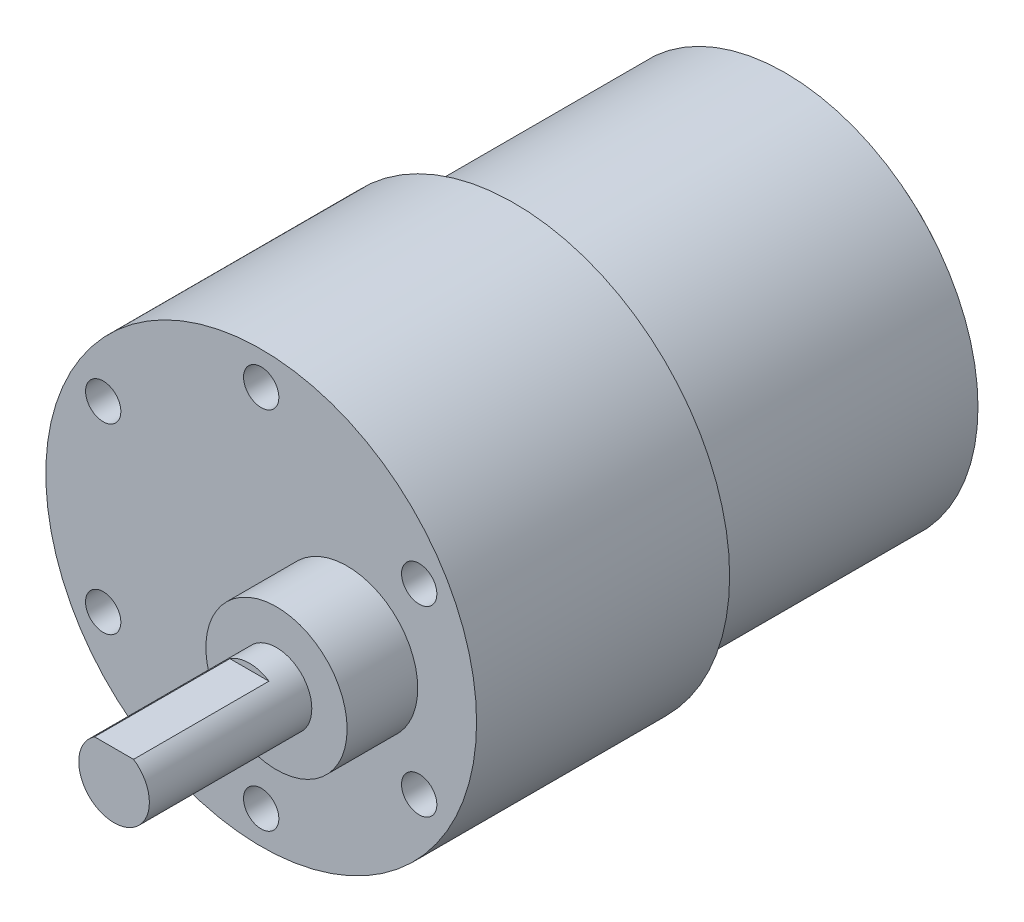
ISO-10303-21;
HEADER;
FILE_DESCRIPTION(('STEP AP214'),'2;1');
FILE_NAME('part.step','',(''),(''),'','','');
FILE_SCHEMA(('AUTOMOTIVE_DESIGN { 1 0 10303 214 1 1 1 1 }'));
ENDSEC;
DATA;
#1=APPLICATION_CONTEXT('core data for automotive mechanical design processes');
#2=APPLICATION_PROTOCOL_DEFINITION('international standard','automotive_design',2000,#1);
#3=PRODUCT_CONTEXT('',#1,'mechanical');
#4=PRODUCT('Part','Part','',(#3));
#5=PRODUCT_RELATED_PRODUCT_CATEGORY('part','',(#4));
#6=PRODUCT_DEFINITION_FORMATION('','',#4);
#7=PRODUCT_DEFINITION_CONTEXT('part definition',#1,'design');
#8=PRODUCT_DEFINITION('design','',#6,#7);
#9=PRODUCT_DEFINITION_SHAPE('','',#8);
#10=(LENGTH_UNIT() NAMED_UNIT(*) SI_UNIT(.MILLI.,.METRE.));
#11=(NAMED_UNIT(*) PLANE_ANGLE_UNIT() SI_UNIT($,.RADIAN.));
#12=(NAMED_UNIT(*) SI_UNIT($,.STERADIAN.) SOLID_ANGLE_UNIT());
#13=UNCERTAINTY_MEASURE_WITH_UNIT(LENGTH_MEASURE(1.E-05),#10,'distance_accuracy_value','');
#14=(GEOMETRIC_REPRESENTATION_CONTEXT(3) GLOBAL_UNCERTAINTY_ASSIGNED_CONTEXT((#13)) GLOBAL_UNIT_ASSIGNED_CONTEXT((#10,
#11,#12)) REPRESENTATION_CONTEXT('',''));
#15=CARTESIAN_POINT('',(0.,0.,0.));
#16=DIRECTION('',(0.,0.,1.));
#17=DIRECTION('',(1.,0.,0.));
#18=AXIS2_PLACEMENT_3D('',#15,#16,#17);
#19=CARTESIAN_POINT('',(0.,0.,-24.));
#20=DIRECTION('',(0.,0.,-1.));
#21=DIRECTION('',(-1.,0.,0.));
#22=AXIS2_PLACEMENT_3D('',#19,#20,#21);
#23=PLANE('',#22);
#24=CARTESIAN_POINT('',(0.,0.,-24.));
#25=DIRECTION('',(0.,0.,-1.));
#26=DIRECTION('',(-1.,0.,0.));
#27=AXIS2_PLACEMENT_3D('',#24,#25,#26);
#28=CIRCLE('',#27,3.);
#29=CARTESIAN_POINT('',(-3.,0.,-24.));
#30=VERTEX_POINT('',#29);
#31=EDGE_CURVE('E302',#30,#30,#28,.T.);
#32=ORIENTED_EDGE('',*,*,#31,.F.);
#33=EDGE_LOOP('',(#32));
#34=FACE_BOUND('',#33,.T.);
#35=DIRECTION('',(1.,0.,0.));
#36=VECTOR('',#35,1.);
#37=CARTESIAN_POINT('',(6.08083524904215,-9.54082068965496,-24.));
#38=LINE('',#37,#36);
#39=CARTESIAN_POINT('',(-6.08083524904215,-9.54082068965496,-24.));
#40=VERTEX_POINT('',#39);
#41=CARTESIAN_POINT('',(6.08083524904215,-9.54082068965496,-24.));
#42=VERTEX_POINT('',#41);
#43=EDGE_CURVE('E279',#40,#42,#38,.T.);
#44=ORIENTED_EDGE('',*,*,#43,.F.);
#45=DIRECTION('',(0.,-1.,0.));
#46=VECTOR('',#45,1.);
#47=CARTESIAN_POINT('',(-6.08083524904215,0.,-24.));
#48=LINE('',#47,#46);
#49=CARTESIAN_POINT('',(-6.08083524904215,-13.7121640405155,-24.));
#50=VERTEX_POINT('',#49);
#51=EDGE_CURVE('E387',#40,#50,#48,.T.);
#52=ORIENTED_EDGE('',*,*,#51,.T.);
#53=CARTESIAN_POINT('',(0.,0.,-24.));
#54=DIRECTION('',(0.,0.,-1.));
#55=DIRECTION('',(-1.,0.,0.));
#56=AXIS2_PLACEMENT_3D('',#53,#54,#55);
#57=CIRCLE('',#56,15.);
#58=CARTESIAN_POINT('',(6.08083524904215,-13.7121640405155,-24.));
#59=VERTEX_POINT('',#58);
#60=EDGE_CURVE('E301',#50,#59,#57,.T.);
#61=ORIENTED_EDGE('',*,*,#60,.T.);
#62=DIRECTION('',(0.,-1.,0.));
#63=VECTOR('',#62,1.);
#64=CARTESIAN_POINT('',(6.08083524904215,-14.0412651340994,-24.));
#65=LINE('',#64,#63);
#66=EDGE_CURVE('E282',#42,#59,#65,.T.);
#67=ORIENTED_EDGE('',*,*,#66,.F.);
#68=EDGE_LOOP('',(#44,#52,#61,#67));
#69=FACE_BOUND('',#68,.T.);
#70=DIRECTION('',(1.,0.,0.));
#71=VECTOR('',#70,1.);
#72=CARTESIAN_POINT('',(5.88965517241378,1.35555555555575,-24.));
#73=LINE('',#72,#71);
#74=CARTESIAN_POINT('',(4.68965517241379,1.35555555555575,-24.));
#75=VERTEX_POINT('',#74);
#76=CARTESIAN_POINT('',(5.88965517241378,1.35555555555575,-24.));
#77=VERTEX_POINT('',#76);
#78=EDGE_CURVE('E248',#75,#77,#73,.T.);
#79=ORIENTED_EDGE('',*,*,#78,.F.);
#80=DIRECTION('',(0.,1.,0.));
#81=VECTOR('',#80,1.);
#82=CARTESIAN_POINT('',(4.68965517241379,-1.35555555555575,-24.));
#83=LINE('',#82,#81);
#84=CARTESIAN_POINT('',(4.68965517241379,-1.35555555555575,-24.));
#85=VERTEX_POINT('',#84);
#86=EDGE_CURVE('E234',#85,#75,#83,.T.);
#87=ORIENTED_EDGE('',*,*,#86,.F.);
#88=DIRECTION('',(-1.,0.,0.));
#89=VECTOR('',#88,1.);
#90=CARTESIAN_POINT('',(5.88965517241378,-1.35555555555575,-24.));
#91=LINE('',#90,#89);
#92=CARTESIAN_POINT('',(5.88965517241378,-1.35555555555575,-24.));
#93=VERTEX_POINT('',#92);
#94=EDGE_CURVE('E239',#93,#85,#91,.T.);
#95=ORIENTED_EDGE('',*,*,#94,.F.);
#96=DIRECTION('',(0.,-1.,0.));
#97=VECTOR('',#96,1.);
#98=CARTESIAN_POINT('',(5.88965517241378,-1.35555555555575,-24.));
#99=LINE('',#98,#97);
#100=EDGE_CURVE('E250',#77,#93,#99,.T.);
#101=ORIENTED_EDGE('',*,*,#100,.F.);
#102=EDGE_LOOP('',(#79,#87,#95,#101));
#103=FACE_BOUND('',#102,.T.);
#104=DIRECTION('',(1.,0.,0.));
#105=VECTOR('',#104,1.);
#106=CARTESIAN_POINT('',(-5.2352490421456,1.35555555555575,-24.));
#107=LINE('',#106,#105);
#108=CARTESIAN_POINT('',(-6.4352490421456,1.35555555555575,-24.));
#109=VERTEX_POINT('',#108);
#110=CARTESIAN_POINT('',(-5.2352490421456,1.35555555555575,-24.));
#111=VERTEX_POINT('',#110);
#112=EDGE_CURVE('E221',#109,#111,#107,.T.);
#113=ORIENTED_EDGE('',*,*,#112,.F.);
#114=DIRECTION('',(0.,1.,0.));
#115=VECTOR('',#114,1.);
#116=CARTESIAN_POINT('',(-6.4352490421456,-1.35555555555575,-24.));
#117=LINE('',#116,#115);
#118=CARTESIAN_POINT('',(-6.4352490421456,-1.35555555555575,-24.));
#119=VERTEX_POINT('',#118);
#120=EDGE_CURVE('E207',#119,#109,#117,.T.);
#121=ORIENTED_EDGE('',*,*,#120,.F.);
#122=DIRECTION('',(-1.,0.,0.));
#123=VECTOR('',#122,1.);
#124=CARTESIAN_POINT('',(-5.2352490421456,-1.35555555555575,-24.));
#125=LINE('',#124,#123);
#126=CARTESIAN_POINT('',(-5.2352490421456,-1.35555555555575,-24.));
#127=VERTEX_POINT('',#126);
#128=EDGE_CURVE('E212',#127,#119,#125,.T.);
#129=ORIENTED_EDGE('',*,*,#128,.F.);
#130=DIRECTION('',(0.,-1.,0.));
#131=VECTOR('',#130,1.);
#132=CARTESIAN_POINT('',(-5.2352490421456,-1.35555555555575,-24.));
#133=LINE('',#132,#131);
#134=EDGE_CURVE('E223',#111,#127,#133,.T.);
#135=ORIENTED_EDGE('',*,*,#134,.F.);
#136=EDGE_LOOP('',(#113,#121,#129,#135));
#137=FACE_BOUND('',#136,.T.);
#138=ADVANCED_FACE('F39',(#34,#69,#103,#137),#23,.T.);
#139=CARTESIAN_POINT('',(5.27663466936308,-14.0412651340994,-24.));
#140=VERTEX_POINT('',#139);
#141=CARTESIAN_POINT('',(-5.27663466936308,-14.0412651340994,-24.));
#142=VERTEX_POINT('',#141);
#143=EDGE_CURVE('E311',#140,#142,#57,.T.);
#144=ORIENTED_EDGE('',*,*,#143,.T.);
#145=DIRECTION('',(1.,0.,0.));
#146=VECTOR('',#145,1.);
#147=CARTESIAN_POINT('',(0.,-14.0412651340994,-24.));
#148=LINE('',#147,#146);
#149=EDGE_CURVE('E305',#142,#140,#148,.T.);
#150=ORIENTED_EDGE('',*,*,#149,.T.);
#151=EDGE_LOOP('',(#144,#150));
#152=FACE_BOUND('',#151,.T.);
#153=ADVANCED_FACE('F425',(#152),#23,.T.);
#154=CARTESIAN_POINT('',(0.,0.,21.5));
#155=DIRECTION('',(0.,0.,-1.));
#156=DIRECTION('',(-1.,0.,0.));
#157=AXIS2_PLACEMENT_3D('',#154,#155,#156);
#158=CYLINDRICAL_SURFACE('',#157,18.3);
#159=CARTESIAN_POINT('',(0.,0.,21.5));
#160=DIRECTION('',(0.,0.,1.));
#161=DIRECTION('',(1.,0.,0.));
#162=AXIS2_PLACEMENT_3D('',#159,#160,#161);
#163=CIRCLE('',#162,18.3);
#164=CARTESIAN_POINT('',(18.3,0.,21.5));
#165=VERTEX_POINT('',#164);
#166=EDGE_CURVE('E338',#165,#165,#163,.T.);
#167=ORIENTED_EDGE('',*,*,#166,.F.);
#168=EDGE_LOOP('',(#167));
#169=FACE_BOUND('',#168,.T.);
#170=CARTESIAN_POINT('',(0.,0.,0.));
#171=DIRECTION('',(0.,0.,1.));
#172=DIRECTION('',(1.,0.,0.));
#173=AXIS2_PLACEMENT_3D('',#170,#171,#172);
#174=CIRCLE('',#173,18.3);
#175=CARTESIAN_POINT('',(18.3,0.,0.));
#176=VERTEX_POINT('',#175);
#177=EDGE_CURVE('E378',#176,#176,#174,.T.);
#178=ORIENTED_EDGE('',*,*,#177,.T.);
#179=EDGE_LOOP('',(#178));
#180=FACE_BOUND('',#179,.T.);
#181=ADVANCED_FACE('F41',(#169,#180),#158,.T.);
#182=CARTESIAN_POINT('',(0.,0.,21.5));
#183=DIRECTION('',(0.,0.,1.));
#184=DIRECTION('',(1.,0.,0.));
#185=AXIS2_PLACEMENT_3D('',#182,#183,#184);
#186=PLANE('',#185);
#187=CARTESIAN_POINT('',(7.3,0.,21.5));
#188=DIRECTION('',(0.,0.,1.));
#189=DIRECTION('',(1.,0.,0.));
#190=AXIS2_PLACEMENT_3D('',#187,#188,#189);
#191=CIRCLE('',#190,6.);
#192=CARTESIAN_POINT('',(13.3,0.,21.5));
#193=VERTEX_POINT('',#192);
#194=EDGE_CURVE('E335',#193,#193,#191,.T.);
#195=ORIENTED_EDGE('',*,*,#194,.F.);
#196=EDGE_LOOP('',(#195));
#197=FACE_BOUND('',#196,.T.);
#198=CARTESIAN_POINT('',(-13.4233937586578,-7.75000000000058,21.5));
#199=DIRECTION('',(0.,0.,1.));
#200=DIRECTION('',(1.,0.,0.));
#201=AXIS2_PLACEMENT_3D('',#198,#199,#200);
#202=CIRCLE('',#201,1.50000000000125);
#203=CARTESIAN_POINT('',(-11.9233937586566,-7.75000000000058,21.5));
#204=VERTEX_POINT('',#203);
#205=EDGE_CURVE('E370',#204,#204,#202,.T.);
#206=ORIENTED_EDGE('',*,*,#205,.F.);
#207=EDGE_LOOP('',(#206));
#208=FACE_BOUND('',#207,.T.);
#209=CARTESIAN_POINT('',(1.31591488089775E-12,-15.5,21.5));
#210=DIRECTION('',(0.,0.,1.));
#211=DIRECTION('',(1.,0.,0.));
#212=AXIS2_PLACEMENT_3D('',#209,#210,#211);
#213=CIRCLE('',#212,1.50000000000136);
#214=CARTESIAN_POINT('',(1.50000000000268,-15.5,21.5));
#215=VERTEX_POINT('',#214);
#216=EDGE_CURVE('E364',#215,#215,#213,.T.);
#217=ORIENTED_EDGE('',*,*,#216,.F.);
#218=EDGE_LOOP('',(#217));
#219=FACE_BOUND('',#218,.T.);
#220=CARTESIAN_POINT('',(13.4233937586598,-7.74999999999943,21.5));
#221=DIRECTION('',(0.,0.,1.));
#222=DIRECTION('',(1.,0.,0.));
#223=AXIS2_PLACEMENT_3D('',#220,#221,#222);
#224=CIRCLE('',#223,1.50000000000085);
#225=CARTESIAN_POINT('',(14.9233937586606,-7.74999999999943,21.5));
#226=VERTEX_POINT('',#225);
#227=EDGE_CURVE('E358',#226,#226,#224,.T.);
#228=ORIENTED_EDGE('',*,*,#227,.F.);
#229=EDGE_LOOP('',(#228));
#230=FACE_BOUND('',#229,.T.);
#231=CARTESIAN_POINT('',(13.4233937586591,7.75000000000057,21.5));
#232=DIRECTION('',(0.,0.,1.));
#233=DIRECTION('',(1.,0.,0.));
#234=AXIS2_PLACEMENT_3D('',#231,#232,#233);
#235=CIRCLE('',#234,1.50000000000019);
#236=CARTESIAN_POINT('',(14.9233937586593,7.75000000000057,21.5));
#237=VERTEX_POINT('',#236);
#238=EDGE_CURVE('E352',#237,#237,#235,.T.);
#239=ORIENTED_EDGE('',*,*,#238,.F.);
#240=EDGE_LOOP('',(#239));
#241=FACE_BOUND('',#240,.T.);
#242=CARTESIAN_POINT('',(0.,15.5,21.5));
#243=DIRECTION('',(0.,0.,1.));
#244=DIRECTION('',(1.,0.,0.));
#245=AXIS2_PLACEMENT_3D('',#242,#243,#244);
#246=CIRCLE('',#245,1.5);
#247=CARTESIAN_POINT('',(1.5,15.5,21.5));
#248=VERTEX_POINT('',#247);
#249=EDGE_CURVE('E345',#248,#248,#246,.T.);
#250=ORIENTED_EDGE('',*,*,#249,.F.);
#251=EDGE_LOOP('',(#250));
#252=FACE_BOUND('',#251,.T.);
#253=CARTESIAN_POINT('',(-13.4233937586585,7.74999999999942,21.5));
#254=DIRECTION('',(0.,0.,1.));
#255=DIRECTION('',(1.,0.,0.));
#256=AXIS2_PLACEMENT_3D('',#253,#254,#255);
#257=CIRCLE('',#256,1.50000000000067);
#258=CARTESIAN_POINT('',(-11.9233937586578,7.74999999999942,21.5));
#259=VERTEX_POINT('',#258);
#260=EDGE_CURVE('E348',#259,#259,#257,.T.);
#261=ORIENTED_EDGE('',*,*,#260,.F.);
#262=EDGE_LOOP('',(#261));
#263=FACE_BOUND('',#262,.T.);
#264=ORIENTED_EDGE('',*,*,#166,.T.);
#265=EDGE_LOOP('',(#264));
#266=FACE_BOUND('',#265,.T.);
#267=ADVANCED_FACE('F523',(#197,#208,#219,#230,#241,#252,#263,#266),#186,.T.);
#268=CARTESIAN_POINT('',(0.,0.,0.));
#269=DIRECTION('',(0.,0.,1.));
#270=DIRECTION('',(1.,0.,0.));
#271=AXIS2_PLACEMENT_3D('',#268,#269,#270);
#272=PLANE('',#271);
#273=CARTESIAN_POINT('',(0.,0.,0.));
#274=DIRECTION('',(0.,0.,-1.));
#275=DIRECTION('',(-1.,0.,0.));
#276=AXIS2_PLACEMENT_3D('',#273,#274,#275);
#277=CIRCLE('',#276,16.4);
#278=CARTESIAN_POINT('',(-16.4,0.,0.));
#279=VERTEX_POINT('',#278);
#280=EDGE_CURVE('E314',#279,#279,#277,.T.);
#281=ORIENTED_EDGE('',*,*,#280,.F.);
#282=EDGE_LOOP('',(#281));
#283=FACE_BOUND('',#282,.T.);
#284=ORIENTED_EDGE('',*,*,#177,.F.);
#285=EDGE_LOOP('',(#284));
#286=FACE_BOUND('',#285,.T.);
#287=ADVANCED_FACE('F521',(#283,#286),#272,.F.);
#288=CARTESIAN_POINT('',(-13.4233937586585,7.74999999999942,16.5));
#289=DIRECTION('',(0.,0.,1.));
#290=DIRECTION('',(1.,0.,0.));
#291=AXIS2_PLACEMENT_3D('',#288,#289,#290);
#292=CYLINDRICAL_SURFACE('',#291,1.50000000000067);
#293=CARTESIAN_POINT('',(-13.4233937586585,7.74999999999942,16.5));
#294=DIRECTION('',(0.,0.,1.));
#295=DIRECTION('',(1.,0.,0.));
#296=AXIS2_PLACEMENT_3D('',#293,#294,#295);
#297=CIRCLE('',#296,1.50000000000067);
#298=CARTESIAN_POINT('',(-11.9233937586578,7.74999999999942,16.5));
#299=VERTEX_POINT('',#298);
#300=EDGE_CURVE('E375',#299,#299,#297,.T.);
#301=ORIENTED_EDGE('',*,*,#300,.F.);
#302=EDGE_LOOP('',(#301));
#303=FACE_BOUND('',#302,.T.);
#304=ORIENTED_EDGE('',*,*,#260,.T.);
#305=EDGE_LOOP('',(#304));
#306=FACE_BOUND('',#305,.T.);
#307=ADVANCED_FACE('F517',(#303,#306),#292,.F.);
#308=CARTESIAN_POINT('',(-13.4233937586585,7.74999999999942,16.5));
#309=DIRECTION('',(0.,0.,1.));
#310=DIRECTION('',(1.,0.,0.));
#311=AXIS2_PLACEMENT_3D('',#308,#309,#310);
#312=PLANE('',#311);
#313=ORIENTED_EDGE('',*,*,#300,.T.);
#314=EDGE_LOOP('',(#313));
#315=FACE_BOUND('',#314,.T.);
#316=ADVANCED_FACE('F479',(#315),#312,.T.);
#317=CARTESIAN_POINT('',(0.,15.5,16.5));
#318=DIRECTION('',(0.,0.,1.));
#319=DIRECTION('',(1.,0.,0.));
#320=AXIS2_PLACEMENT_3D('',#317,#318,#319);
#321=CYLINDRICAL_SURFACE('',#320,1.5);
#322=CARTESIAN_POINT('',(0.,15.5,16.5));
#323=DIRECTION('',(0.,0.,1.));
#324=DIRECTION('',(1.,0.,0.));
#325=AXIS2_PLACEMENT_3D('',#322,#323,#324);
#326=CIRCLE('',#325,1.5);
#327=CARTESIAN_POINT('',(1.5,15.5,16.5));
#328=VERTEX_POINT('',#327);
#329=EDGE_CURVE('E349',#328,#328,#326,.T.);
#330=ORIENTED_EDGE('',*,*,#329,.F.);
#331=EDGE_LOOP('',(#330));
#332=FACE_BOUND('',#331,.T.);
#333=ORIENTED_EDGE('',*,*,#249,.T.);
#334=EDGE_LOOP('',(#333));
#335=FACE_BOUND('',#334,.T.);
#336=ADVANCED_FACE('F475',(#332,#335),#321,.F.);
#337=CARTESIAN_POINT('',(0.,15.5,16.5));
#338=DIRECTION('',(0.,0.,1.));
#339=DIRECTION('',(1.,0.,0.));
#340=AXIS2_PLACEMENT_3D('',#337,#338,#339);
#341=PLANE('',#340);
#342=ORIENTED_EDGE('',*,*,#329,.T.);
#343=EDGE_LOOP('',(#342));
#344=FACE_BOUND('',#343,.T.);
#345=ADVANCED_FACE('F478',(#344),#341,.T.);
#346=CARTESIAN_POINT('',(13.4233937586591,7.75000000000057,16.5));
#347=DIRECTION('',(0.,0.,1.));
#348=DIRECTION('',(1.,0.,0.));
#349=AXIS2_PLACEMENT_3D('',#346,#347,#348);
#350=CYLINDRICAL_SURFACE('',#349,1.50000000000019);
#351=CARTESIAN_POINT('',(13.4233937586591,7.75000000000057,16.5));
#352=DIRECTION('',(0.,0.,1.));
#353=DIRECTION('',(1.,0.,0.));
#354=AXIS2_PLACEMENT_3D('',#351,#352,#353);
#355=CIRCLE('',#354,1.50000000000019);
#356=CARTESIAN_POINT('',(14.9233937586593,7.75000000000057,16.5));
#357=VERTEX_POINT('',#356);
#358=EDGE_CURVE('E355',#357,#357,#355,.T.);
#359=ORIENTED_EDGE('',*,*,#358,.F.);
#360=EDGE_LOOP('',(#359));
#361=FACE_BOUND('',#360,.T.);
#362=ORIENTED_EDGE('',*,*,#238,.T.);
#363=EDGE_LOOP('',(#362));
#364=FACE_BOUND('',#363,.T.);
#365=ADVANCED_FACE('F483',(#361,#364),#350,.F.);
#366=CARTESIAN_POINT('',(13.4233937586591,7.75000000000057,16.5));
#367=DIRECTION('',(0.,0.,1.));
#368=DIRECTION('',(1.,0.,0.));
#369=AXIS2_PLACEMENT_3D('',#366,#367,#368);
#370=PLANE('',#369);
#371=ORIENTED_EDGE('',*,*,#358,.T.);
#372=EDGE_LOOP('',(#371));
#373=FACE_BOUND('',#372,.T.);
#374=ADVANCED_FACE('F487',(#373),#370,.T.);
#375=CARTESIAN_POINT('',(13.4233937586598,-7.74999999999943,16.5));
#376=DIRECTION('',(0.,0.,1.));
#377=DIRECTION('',(1.,0.,0.));
#378=AXIS2_PLACEMENT_3D('',#375,#376,#377);
#379=CYLINDRICAL_SURFACE('',#378,1.50000000000085);
#380=CARTESIAN_POINT('',(13.4233937586598,-7.74999999999943,16.5));
#381=DIRECTION('',(0.,0.,1.));
#382=DIRECTION('',(1.,0.,0.));
#383=AXIS2_PLACEMENT_3D('',#380,#381,#382);
#384=CIRCLE('',#383,1.50000000000085);
#385=CARTESIAN_POINT('',(14.9233937586606,-7.74999999999943,16.5));
#386=VERTEX_POINT('',#385);
#387=EDGE_CURVE('E361',#386,#386,#384,.T.);
#388=ORIENTED_EDGE('',*,*,#387,.F.);
#389=EDGE_LOOP('',(#388));
#390=FACE_BOUND('',#389,.T.);
#391=ORIENTED_EDGE('',*,*,#227,.T.);
#392=EDGE_LOOP('',(#391));
#393=FACE_BOUND('',#392,.T.);
#394=ADVANCED_FACE('F491',(#390,#393),#379,.F.);
#395=CARTESIAN_POINT('',(13.4233937586598,-7.74999999999943,16.5));
#396=DIRECTION('',(0.,0.,1.));
#397=DIRECTION('',(1.,0.,0.));
#398=AXIS2_PLACEMENT_3D('',#395,#396,#397);
#399=PLANE('',#398);
#400=ORIENTED_EDGE('',*,*,#387,.T.);
#401=EDGE_LOOP('',(#400));
#402=FACE_BOUND('',#401,.T.);
#403=ADVANCED_FACE('F495',(#402),#399,.T.);
#404=CARTESIAN_POINT('',(1.31591488089775E-12,-15.5,16.5));
#405=DIRECTION('',(0.,0.,1.));
#406=DIRECTION('',(1.,0.,0.));
#407=AXIS2_PLACEMENT_3D('',#404,#405,#406);
#408=CYLINDRICAL_SURFACE('',#407,1.50000000000136);
#409=CARTESIAN_POINT('',(1.31591488089775E-12,-15.5,16.5));
#410=DIRECTION('',(0.,0.,1.));
#411=DIRECTION('',(1.,0.,0.));
#412=AXIS2_PLACEMENT_3D('',#409,#410,#411);
#413=CIRCLE('',#412,1.50000000000136);
#414=CARTESIAN_POINT('',(1.50000000000268,-15.5,16.5));
#415=VERTEX_POINT('',#414);
#416=EDGE_CURVE('E367',#415,#415,#413,.T.);
#417=ORIENTED_EDGE('',*,*,#416,.F.);
#418=EDGE_LOOP('',(#417));
#419=FACE_BOUND('',#418,.T.);
#420=ORIENTED_EDGE('',*,*,#216,.T.);
#421=EDGE_LOOP('',(#420));
#422=FACE_BOUND('',#421,.T.);
#423=ADVANCED_FACE('F499',(#419,#422),#408,.F.);
#424=CARTESIAN_POINT('',(1.31591488089775E-12,-15.5,16.5));
#425=DIRECTION('',(0.,0.,1.));
#426=DIRECTION('',(1.,0.,0.));
#427=AXIS2_PLACEMENT_3D('',#424,#425,#426);
#428=PLANE('',#427);
#429=ORIENTED_EDGE('',*,*,#416,.T.);
#430=EDGE_LOOP('',(#429));
#431=FACE_BOUND('',#430,.T.);
#432=ADVANCED_FACE('F503',(#431),#428,.T.);
#433=CARTESIAN_POINT('',(-13.4233937586578,-7.75000000000058,16.5));
#434=DIRECTION('',(0.,0.,1.));
#435=DIRECTION('',(1.,0.,0.));
#436=AXIS2_PLACEMENT_3D('',#433,#434,#435);
#437=CYLINDRICAL_SURFACE('',#436,1.50000000000125);
#438=CARTESIAN_POINT('',(-13.4233937586578,-7.75000000000058,16.5));
#439=DIRECTION('',(0.,0.,1.));
#440=DIRECTION('',(1.,0.,0.));
#441=AXIS2_PLACEMENT_3D('',#438,#439,#440);
#442=CIRCLE('',#441,1.50000000000125);
#443=CARTESIAN_POINT('',(-11.9233937586566,-7.75000000000058,16.5));
#444=VERTEX_POINT('',#443);
#445=EDGE_CURVE('E342',#444,#444,#442,.T.);
#446=ORIENTED_EDGE('',*,*,#445,.F.);
#447=EDGE_LOOP('',(#446));
#448=FACE_BOUND('',#447,.T.);
#449=ORIENTED_EDGE('',*,*,#205,.T.);
#450=EDGE_LOOP('',(#449));
#451=FACE_BOUND('',#450,.T.);
#452=ADVANCED_FACE('F507',(#448,#451),#437,.F.);
#453=CARTESIAN_POINT('',(-13.4233937586578,-7.75000000000058,16.5));
#454=DIRECTION('',(0.,0.,1.));
#455=DIRECTION('',(1.,0.,0.));
#456=AXIS2_PLACEMENT_3D('',#453,#454,#455);
#457=PLANE('',#456);
#458=ORIENTED_EDGE('',*,*,#445,.T.);
#459=EDGE_LOOP('',(#458));
#460=FACE_BOUND('',#459,.T.);
#461=ADVANCED_FACE('F473',(#460),#457,.T.);
#462=CARTESIAN_POINT('',(7.3,0.,27.5));
#463=DIRECTION('',(0.,0.,-1.));
#464=DIRECTION('',(-1.,0.,0.));
#465=AXIS2_PLACEMENT_3D('',#462,#463,#464);
#466=CYLINDRICAL_SURFACE('',#465,6.);
#467=CARTESIAN_POINT('',(7.3,0.,27.5));
#468=DIRECTION('',(0.,0.,1.));
#469=DIRECTION('',(1.,0.,0.));
#470=AXIS2_PLACEMENT_3D('',#467,#468,#469);
#471=CIRCLE('',#470,6.);
#472=CARTESIAN_POINT('',(13.3,0.,27.5));
#473=VERTEX_POINT('',#472);
#474=EDGE_CURVE('E339',#473,#473,#471,.T.);
#475=ORIENTED_EDGE('',*,*,#474,.F.);
#476=EDGE_LOOP('',(#475));
#477=FACE_BOUND('',#476,.T.);
#478=ORIENTED_EDGE('',*,*,#194,.T.);
#479=EDGE_LOOP('',(#478));
#480=FACE_BOUND('',#479,.T.);
#481=ADVANCED_FACE('F469',(#477,#480),#466,.T.);
#482=CARTESIAN_POINT('',(7.3,0.,27.5));
#483=DIRECTION('',(0.,0.,1.));
#484=DIRECTION('',(1.,0.,0.));
#485=AXIS2_PLACEMENT_3D('',#482,#483,#484);
#486=PLANE('',#485);
#487=CARTESIAN_POINT('',(7.3,0.,27.5));
#488=DIRECTION('',(0.,0.,1.));
#489=DIRECTION('',(1.,0.,0.));
#490=AXIS2_PLACEMENT_3D('',#487,#488,#489);
#491=CIRCLE('',#490,3.);
#492=CARTESIAN_POINT('',(10.3,0.,27.5));
#493=VERTEX_POINT('',#492);
#494=EDGE_CURVE('E320',#493,#493,#491,.T.);
#495=ORIENTED_EDGE('',*,*,#494,.F.);
#496=EDGE_LOOP('',(#495));
#497=FACE_BOUND('',#496,.T.);
#498=ORIENTED_EDGE('',*,*,#474,.T.);
#499=EDGE_LOOP('',(#498));
#500=FACE_BOUND('',#499,.T.);
#501=ADVANCED_FACE('F465',(#497,#500),#486,.T.);
#502=CARTESIAN_POINT('',(7.3,0.,41.3));
#503=DIRECTION('',(0.,0.,-1.));
#504=DIRECTION('',(-1.,0.,0.));
#505=AXIS2_PLACEMENT_3D('',#502,#503,#504);
#506=CYLINDRICAL_SURFACE('',#505,3.);
#507=CARTESIAN_POINT('',(7.3,0.,41.3));
#508=DIRECTION('',(0.,0.,1.));
#509=DIRECTION('',(1.,0.,0.));
#510=AXIS2_PLACEMENT_3D('',#507,#508,#509);
#511=CIRCLE('',#510,3.);
#512=CARTESIAN_POINT('',(5.6416876048223,2.5,41.3));
#513=VERTEX_POINT('',#512);
#514=CARTESIAN_POINT('',(8.9583123951777,2.5,41.3));
#515=VERTEX_POINT('',#514);
#516=EDGE_CURVE('E331',#513,#515,#511,.T.);
#517=ORIENTED_EDGE('',*,*,#516,.F.);
#518=DIRECTION('',(0.,0.,1.));
#519=VECTOR('',#518,1.);
#520=CARTESIAN_POINT('',(5.6416876048223,2.5,29.8));
#521=LINE('',#520,#519);
#522=CARTESIAN_POINT('',(5.6416876048223,2.5,29.8));
#523=VERTEX_POINT('',#522);
#524=EDGE_CURVE('E326',#523,#513,#521,.T.);
#525=ORIENTED_EDGE('',*,*,#524,.F.);
#526=CARTESIAN_POINT('',(7.3,0.,29.8));
#527=DIRECTION('',(0.,0.,1.));
#528=DIRECTION('',(-1.,0.,0.));
#529=AXIS2_PLACEMENT_3D('',#526,#527,#528);
#530=CIRCLE('',#529,3.);
#531=CARTESIAN_POINT('',(8.9583123951777,2.5,29.8));
#532=VERTEX_POINT('',#531);
#533=EDGE_CURVE('E321',#532,#523,#530,.T.);
#534=ORIENTED_EDGE('',*,*,#533,.F.);
#535=DIRECTION('',(0.,0.,1.));
#536=VECTOR('',#535,1.);
#537=CARTESIAN_POINT('',(8.9583123951777,2.5,29.8));
#538=LINE('',#537,#536);
#539=EDGE_CURVE('E328',#532,#515,#538,.T.);
#540=ORIENTED_EDGE('',*,*,#539,.T.);
#541=EDGE_LOOP('',(#517,#525,#534,#540));
#542=FACE_BOUND('',#541,.T.);
#543=ORIENTED_EDGE('',*,*,#494,.T.);
#544=EDGE_LOOP('',(#543));
#545=FACE_BOUND('',#544,.T.);
#546=ADVANCED_FACE('F461',(#542,#545),#506,.T.);
#547=CARTESIAN_POINT('',(7.3,0.,41.3));
#548=DIRECTION('',(0.,0.,1.));
#549=DIRECTION('',(1.,0.,0.));
#550=AXIS2_PLACEMENT_3D('',#547,#548,#549);
#551=PLANE('',#550);
#552=DIRECTION('',(1.,0.,0.));
#553=VECTOR('',#552,1.);
#554=CARTESIAN_POINT('',(5.6416876048223,2.5,41.3));
#555=LINE('',#554,#553);
#556=EDGE_CURVE('E317',#513,#515,#555,.T.);
#557=ORIENTED_EDGE('',*,*,#556,.F.);
#558=ORIENTED_EDGE('',*,*,#516,.T.);
#559=EDGE_LOOP('',(#557,#558));
#560=FACE_BOUND('',#559,.T.);
#561=ADVANCED_FACE('F457',(#560),#551,.T.);
#562=CARTESIAN_POINT('',(5.6416876048223,2.5,29.8));
#563=DIRECTION('',(0.,-1.,0.));
#564=DIRECTION('',(0.,0.,-1.));
#565=AXIS2_PLACEMENT_3D('',#562,#563,#564);
#566=PLANE('',#565);
#567=ORIENTED_EDGE('',*,*,#556,.T.);
#568=ORIENTED_EDGE('',*,*,#539,.F.);
#569=DIRECTION('',(1.,0.,0.));
#570=VECTOR('',#569,1.);
#571=CARTESIAN_POINT('',(5.6416876048223,2.5,29.8));
#572=LINE('',#571,#570);
#573=EDGE_CURVE('E323',#523,#532,#572,.T.);
#574=ORIENTED_EDGE('',*,*,#573,.F.);
#575=ORIENTED_EDGE('',*,*,#524,.T.);
#576=EDGE_LOOP('',(#567,#568,#574,#575));
#577=FACE_BOUND('',#576,.T.);
#578=ADVANCED_FACE('F453',(#577),#566,.F.);
#579=CARTESIAN_POINT('',(7.3,0.,29.8));
#580=DIRECTION('',(0.,0.,-1.));
#581=DIRECTION('',(-1.,0.,0.));
#582=AXIS2_PLACEMENT_3D('',#579,#580,#581);
#583=PLANE('',#582);
#584=ORIENTED_EDGE('',*,*,#533,.T.);
#585=ORIENTED_EDGE('',*,*,#573,.T.);
#586=EDGE_LOOP('',(#584,#585));
#587=FACE_BOUND('',#586,.T.);
#588=ADVANCED_FACE('F449',(#587),#583,.F.);
#589=CARTESIAN_POINT('',(0.,0.,-23.));
#590=DIRECTION('',(0.,0.,1.));
#591=DIRECTION('',(1.,0.,0.));
#592=AXIS2_PLACEMENT_3D('',#589,#590,#591);
#593=CYLINDRICAL_SURFACE('',#592,16.4);
#594=CARTESIAN_POINT('',(0.,0.,-23.));
#595=DIRECTION('',(0.,0.,-1.));
#596=DIRECTION('',(-1.,0.,0.));
#597=AXIS2_PLACEMENT_3D('',#594,#595,#596);
#598=CIRCLE('',#597,16.4);
#599=CARTESIAN_POINT('',(-16.4,0.,-23.));
#600=VERTEX_POINT('',#599);
#601=EDGE_CURVE('E310',#600,#600,#598,.T.);
#602=ORIENTED_EDGE('',*,*,#601,.F.);
#603=EDGE_LOOP('',(#602));
#604=FACE_BOUND('',#603,.T.);
#605=ORIENTED_EDGE('',*,*,#280,.T.);
#606=EDGE_LOOP('',(#605));
#607=FACE_BOUND('',#606,.T.);
#608=ADVANCED_FACE('F445',(#604,#607),#593,.T.);
#609=CARTESIAN_POINT('',(0.,0.,-23.));
#610=DIRECTION('',(0.,0.,-1.));
#611=DIRECTION('',(-1.,0.,0.));
#612=AXIS2_PLACEMENT_3D('',#609,#610,#611);
#613=PLANE('',#612);
#614=CARTESIAN_POINT('',(0.,0.,-23.));
#615=DIRECTION('',(0.,0.,-1.));
#616=DIRECTION('',(-1.,0.,0.));
#617=AXIS2_PLACEMENT_3D('',#614,#615,#616);
#618=CIRCLE('',#617,15.);
#619=CARTESIAN_POINT('',(-15.,0.,-23.));
#620=VERTEX_POINT('',#619);
#621=EDGE_CURVE('E306',#620,#620,#618,.T.);
#622=ORIENTED_EDGE('',*,*,#621,.F.);
#623=EDGE_LOOP('',(#622));
#624=FACE_BOUND('',#623,.T.);
#625=ORIENTED_EDGE('',*,*,#601,.T.);
#626=EDGE_LOOP('',(#625));
#627=FACE_BOUND('',#626,.T.);
#628=ADVANCED_FACE('F441',(#624,#627),#613,.T.);
#629=CARTESIAN_POINT('',(0.,0.,-24.));
#630=DIRECTION('',(0.,0.,1.));
#631=DIRECTION('',(1.,0.,0.));
#632=AXIS2_PLACEMENT_3D('',#629,#630,#631);
#633=CYLINDRICAL_SURFACE('',#632,15.);
#634=EDGE_CURVE('E307',#59,#140,#57,.T.);
#635=ORIENTED_EDGE('',*,*,#634,.F.);
#636=ORIENTED_EDGE('',*,*,#60,.F.);
#637=EDGE_CURVE('E848',#142,#50,#57,.T.);
#638=ORIENTED_EDGE('',*,*,#637,.F.);
#639=ORIENTED_EDGE('',*,*,#143,.F.);
#640=EDGE_LOOP('',(#635,#636,#638,#639));
#641=FACE_BOUND('',#640,.T.);
#642=ORIENTED_EDGE('',*,*,#621,.T.);
#643=EDGE_LOOP('',(#642));
#644=FACE_BOUND('',#643,.T.);
#645=ADVANCED_FACE('F438',(#641,#644),#633,.T.);
#646=CARTESIAN_POINT('',(0.,0.,-28.));
#647=DIRECTION('',(0.,0.,1.));
#648=DIRECTION('',(1.,0.,0.));
#649=AXIS2_PLACEMENT_3D('',#646,#647,#648);
#650=CYLINDRICAL_SURFACE('',#649,3.);
#651=CARTESIAN_POINT('',(0.,0.,-28.));
#652=DIRECTION('',(0.,0.,-1.));
#653=DIRECTION('',(-1.,0.,0.));
#654=AXIS2_PLACEMENT_3D('',#651,#652,#653);
#655=CIRCLE('',#654,3.);
#656=CARTESIAN_POINT('',(-3.,0.,-28.));
#657=VERTEX_POINT('',#656);
#658=EDGE_CURVE('E298',#657,#657,#655,.T.);
#659=ORIENTED_EDGE('',*,*,#658,.F.);
#660=EDGE_LOOP('',(#659));
#661=FACE_BOUND('',#660,.T.);
#662=ORIENTED_EDGE('',*,*,#31,.T.);
#663=EDGE_LOOP('',(#662));
#664=FACE_BOUND('',#663,.T.);
#665=ADVANCED_FACE('F436',(#661,#664),#650,.T.);
#666=CARTESIAN_POINT('',(0.,0.,-28.));
#667=DIRECTION('',(0.,0.,-1.));
#668=DIRECTION('',(-1.,0.,0.));
#669=AXIS2_PLACEMENT_3D('',#666,#667,#668);
#670=PLANE('',#669);
#671=ORIENTED_EDGE('',*,*,#658,.T.);
#672=EDGE_LOOP('',(#671));
#673=FACE_BOUND('',#672,.T.);
#674=ADVANCED_FACE('F614',(#673),#670,.T.);
#675=CARTESIAN_POINT('',(0.,0.,-24.));
#676=DIRECTION('',(0.,0.,1.));
#677=DIRECTION('',(1.,0.,0.));
#678=AXIS2_PLACEMENT_3D('',#675,#676,#677);
#679=PLANE('',#678);
#680=ORIENTED_EDGE('',*,*,#637,.T.);
#681=DIRECTION('',(0.,1.,0.));
#682=VECTOR('',#681,1.);
#683=CARTESIAN_POINT('',(-6.08083524904215,-14.0412651340994,-24.));
#684=LINE('',#683,#682);
#685=CARTESIAN_POINT('',(-6.08083524904215,-14.0412651340994,-24.));
#686=VERTEX_POINT('',#685);
#687=EDGE_CURVE('E263',#686,#50,#684,.T.);
#688=ORIENTED_EDGE('',*,*,#687,.F.);
#689=DIRECTION('',(-1.,0.,0.));
#690=VECTOR('',#689,1.);
#691=CARTESIAN_POINT('',(6.08083524904215,-14.0412651340994,-24.));
#692=LINE('',#691,#690);
#693=EDGE_CURVE('E285',#142,#686,#692,.T.);
#694=ORIENTED_EDGE('',*,*,#693,.F.);
#695=EDGE_LOOP('',(#680,#688,#694));
#696=FACE_BOUND('',#695,.T.);
#697=ADVANCED_FACE('F622',(#696),#679,.T.);
#698=CARTESIAN_POINT('',(-6.08083524904215,-14.0412651340994,-31.9));
#699=DIRECTION('',(1.,0.,0.));
#700=DIRECTION('',(0.,0.,-1.));
#701=AXIS2_PLACEMENT_3D('',#698,#699,#700);
#702=PLANE('',#701);
#703=ORIENTED_EDGE('',*,*,#687,.T.);
#704=ORIENTED_EDGE('',*,*,#51,.F.);
#705=DIRECTION('',(0.,0.,1.));
#706=VECTOR('',#705,1.);
#707=CARTESIAN_POINT('',(-6.08083524904215,-9.54082068965496,-31.9));
#708=LINE('',#707,#706);
#709=CARTESIAN_POINT('',(-6.08083524904215,-9.54082068965496,-31.9));
#710=VERTEX_POINT('',#709);
#711=EDGE_CURVE('E295',#710,#40,#708,.T.);
#712=ORIENTED_EDGE('',*,*,#711,.F.);
#713=DIRECTION('',(0.,1.,0.));
#714=VECTOR('',#713,1.);
#715=CARTESIAN_POINT('',(-6.08083524904215,-14.0412651340994,-31.9));
#716=LINE('',#715,#714);
#717=CARTESIAN_POINT('',(-6.08083524904215,-14.0412651340994,-31.9));
#718=VERTEX_POINT('',#717);
#719=EDGE_CURVE('E264',#718,#710,#716,.T.);
#720=ORIENTED_EDGE('',*,*,#719,.F.);
#721=DIRECTION('',(0.,0.,1.));
#722=VECTOR('',#721,1.);
#723=CARTESIAN_POINT('',(-6.08083524904215,-14.0412651340994,-31.9));
#724=LINE('',#723,#722);
#725=EDGE_CURVE('E276',#718,#686,#724,.T.);
#726=ORIENTED_EDGE('',*,*,#725,.T.);
#727=EDGE_LOOP('',(#703,#704,#712,#720,#726));
#728=FACE_BOUND('',#727,.T.);
#729=ADVANCED_FACE('F401',(#728),#702,.F.);
#730=CARTESIAN_POINT('',(6.08083524904215,-9.54082068965496,-31.9));
#731=DIRECTION('',(0.,-1.,0.));
#732=DIRECTION('',(0.,0.,-1.));
#733=AXIS2_PLACEMENT_3D('',#730,#731,#732);
#734=PLANE('',#733);
#735=ORIENTED_EDGE('',*,*,#43,.T.);
#736=DIRECTION('',(0.,0.,1.));
#737=VECTOR('',#736,1.);
#738=CARTESIAN_POINT('',(6.08083524904215,-9.54082068965496,-31.9));
#739=LINE('',#738,#737);
#740=CARTESIAN_POINT('',(6.08083524904215,-9.54082068965496,-31.9));
#741=VERTEX_POINT('',#740);
#742=EDGE_CURVE('E292',#741,#42,#739,.T.);
#743=ORIENTED_EDGE('',*,*,#742,.F.);
#744=DIRECTION('',(1.,0.,0.));
#745=VECTOR('',#744,1.);
#746=CARTESIAN_POINT('',(6.08083524904215,-9.54082068965496,-31.9));
#747=LINE('',#746,#745);
#748=EDGE_CURVE('E267',#710,#741,#747,.T.);
#749=ORIENTED_EDGE('',*,*,#748,.F.);
#750=ORIENTED_EDGE('',*,*,#711,.T.);
#751=EDGE_LOOP('',(#735,#743,#749,#750));
#752=FACE_BOUND('',#751,.T.);
#753=ADVANCED_FACE('F406',(#752),#734,.F.);
#754=CARTESIAN_POINT('',(6.08083524904215,-14.0412651340994,-31.9));
#755=DIRECTION('',(-1.,0.,0.));
#756=DIRECTION('',(0.,0.,1.));
#757=AXIS2_PLACEMENT_3D('',#754,#755,#756);
#758=PLANE('',#757);
#759=ORIENTED_EDGE('',*,*,#66,.T.);
#760=CARTESIAN_POINT('',(6.08083524904215,-14.0412651340994,-24.));
#761=VERTEX_POINT('',#760);
#762=EDGE_CURVE('E281',#59,#761,#65,.T.);
#763=ORIENTED_EDGE('',*,*,#762,.T.);
#764=DIRECTION('',(0.,0.,1.));
#765=VECTOR('',#764,1.);
#766=CARTESIAN_POINT('',(6.08083524904215,-14.0412651340994,-31.9));
#767=LINE('',#766,#765);
#768=CARTESIAN_POINT('',(6.08083524904215,-14.0412651340994,-31.9));
#769=VERTEX_POINT('',#768);
#770=EDGE_CURVE('E289',#769,#761,#767,.T.);
#771=ORIENTED_EDGE('',*,*,#770,.F.);
#772=DIRECTION('',(0.,-1.,0.));
#773=VECTOR('',#772,1.);
#774=CARTESIAN_POINT('',(6.08083524904215,-14.0412651340994,-31.9));
#775=LINE('',#774,#773);
#776=EDGE_CURVE('E270',#741,#769,#775,.T.);
#777=ORIENTED_EDGE('',*,*,#776,.F.);
#778=ORIENTED_EDGE('',*,*,#742,.T.);
#779=EDGE_LOOP('',(#759,#763,#771,#777,#778));
#780=FACE_BOUND('',#779,.T.);
#781=ADVANCED_FACE('F410',(#780),#758,.F.);
#782=CARTESIAN_POINT('',(6.08083524904215,-14.0412651340994,-31.9));
#783=DIRECTION('',(0.,1.,0.));
#784=DIRECTION('',(0.,0.,1.));
#785=AXIS2_PLACEMENT_3D('',#782,#783,#784);
#786=PLANE('',#785);
#787=DIRECTION('',(-1.,0.,0.));
#788=VECTOR('',#787,1.);
#789=CARTESIAN_POINT('',(6.08083524904215,-14.0412651340994,-31.9));
#790=LINE('',#789,#788);
#791=CARTESIAN_POINT('',(-5.08992939077893,-14.0412651340994,-31.9));
#792=VERTEX_POINT('',#791);
#793=EDGE_CURVE('E272',#792,#718,#790,.T.);
#794=ORIENTED_EDGE('',*,*,#793,.F.);
#795=DIRECTION('',(0.,0.,1.));
#796=VECTOR('',#795,1.);
#797=CARTESIAN_POINT('',(-5.08992939077893,-14.0412651340994,-31.9));
#798=LINE('',#797,#796);
#799=CARTESIAN_POINT('',(-5.08992939077893,-14.0412651340994,-25.9));
#800=VERTEX_POINT('',#799);
#801=EDGE_CURVE('E205',#792,#800,#798,.T.);
#802=ORIENTED_EDGE('',*,*,#801,.T.);
#803=DIRECTION('',(1.,0.,0.));
#804=VECTOR('',#803,1.);
#805=CARTESIAN_POINT('',(6.08083524904215,-14.0412651340994,-25.9));
#806=LINE('',#805,#804);
#807=CARTESIAN_POINT('',(5.08992939077893,-14.0412651340994,-25.9));
#808=VERTEX_POINT('',#807);
#809=EDGE_CURVE('E11',#800,#808,#806,.T.);
#810=ORIENTED_EDGE('',*,*,#809,.T.);
#811=DIRECTION('',(0.,0.,-1.));
#812=VECTOR('',#811,1.);
#813=CARTESIAN_POINT('',(5.08992939077893,-14.0412651340994,-31.9));
#814=LINE('',#813,#812);
#815=CARTESIAN_POINT('',(5.08992939077893,-14.0412651340994,-31.9));
#816=VERTEX_POINT('',#815);
#817=EDGE_CURVE('E201',#808,#816,#814,.T.);
#818=ORIENTED_EDGE('',*,*,#817,.T.);
#819=EDGE_CURVE('E273',#769,#816,#790,.T.);
#820=ORIENTED_EDGE('',*,*,#819,.F.);
#821=ORIENTED_EDGE('',*,*,#770,.T.);
#822=EDGE_CURVE('E268',#761,#140,#692,.T.);
#823=ORIENTED_EDGE('',*,*,#822,.T.);
#824=ORIENTED_EDGE('',*,*,#149,.F.);
#825=ORIENTED_EDGE('',*,*,#693,.T.);
#826=ORIENTED_EDGE('',*,*,#725,.F.);
#827=EDGE_LOOP('',(#794,#802,#810,#818,#820,#821,#823,#824,#825,#826));
#828=FACE_BOUND('',#827,.T.);
#829=ADVANCED_FACE('F395',(#828),#786,.F.);
#830=CARTESIAN_POINT('',(0.,0.,-31.9));
#831=DIRECTION('',(0.,0.,1.));
#832=DIRECTION('',(1.,0.,0.));
#833=AXIS2_PLACEMENT_3D('',#830,#831,#832);
#834=PLANE('',#833);
#835=DIRECTION('',(1.,0.,0.));
#836=VECTOR('',#835,1.);
#837=CARTESIAN_POINT('',(5.08992939077893,-10.8564698401243,-31.9));
#838=LINE('',#837,#836);
#839=CARTESIAN_POINT('',(-5.08992939077893,-10.8564698401243,-31.9));
#840=VERTEX_POINT('',#839);
#841=CARTESIAN_POINT('',(5.08992939077893,-10.8564698401243,-31.9));
#842=VERTEX_POINT('',#841);
#843=EDGE_CURVE('E198',#840,#842,#838,.T.);
#844=ORIENTED_EDGE('',*,*,#843,.F.);
#845=DIRECTION('',(0.,-1.,0.));
#846=VECTOR('',#845,1.);
#847=CARTESIAN_POINT('',(-5.08992939077893,0.,-31.9));
#848=LINE('',#847,#846);
#849=EDGE_CURVE('E47',#840,#792,#848,.T.);
#850=ORIENTED_EDGE('',*,*,#849,.T.);
#851=ORIENTED_EDGE('',*,*,#793,.T.);
#852=ORIENTED_EDGE('',*,*,#719,.T.);
#853=ORIENTED_EDGE('',*,*,#748,.T.);
#854=ORIENTED_EDGE('',*,*,#776,.T.);
#855=ORIENTED_EDGE('',*,*,#819,.T.);
#856=DIRECTION('',(0.,-1.,0.));
#857=VECTOR('',#856,1.);
#858=CARTESIAN_POINT('',(5.08992939077893,-17.2260604280745,-31.9));
#859=LINE('',#858,#857);
#860=EDGE_CURVE('E185',#842,#816,#859,.T.);
#861=ORIENTED_EDGE('',*,*,#860,.F.);
#862=EDGE_LOOP('',(#844,#850,#851,#852,#853,#854,#855,#861));
#863=FACE_BOUND('',#862,.T.);
#864=ADVANCED_FACE('F391',(#863),#834,.F.);
#865=ORIENTED_EDGE('',*,*,#634,.T.);
#866=ORIENTED_EDGE('',*,*,#822,.F.);
#867=ORIENTED_EDGE('',*,*,#762,.F.);
#868=EDGE_LOOP('',(#865,#866,#867));
#869=FACE_BOUND('',#868,.T.);
#870=ADVANCED_FACE('F643',(#869),#679,.T.);
#871=CARTESIAN_POINT('',(4.68965517241379,-1.35555555555575,-28.));
#872=DIRECTION('',(1.,0.,0.));
#873=DIRECTION('',(0.,0.,-1.));
#874=AXIS2_PLACEMENT_3D('',#871,#872,#873);
#875=PLANE('',#874);
#876=ORIENTED_EDGE('',*,*,#86,.T.);
#877=DIRECTION('',(0.,0.,1.));
#878=VECTOR('',#877,1.);
#879=CARTESIAN_POINT('',(4.68965517241379,1.35555555555575,-28.));
#880=LINE('',#879,#878);
#881=CARTESIAN_POINT('',(4.68965517241379,1.35555555555575,-28.));
#882=VERTEX_POINT('',#881);
#883=EDGE_CURVE('E261',#882,#75,#880,.T.);
#884=ORIENTED_EDGE('',*,*,#883,.F.);
#885=DIRECTION('',(0.,1.,0.));
#886=VECTOR('',#885,1.);
#887=CARTESIAN_POINT('',(4.68965517241379,-1.35555555555575,-28.));
#888=LINE('',#887,#886);
#889=CARTESIAN_POINT('',(4.68965517241379,-1.35555555555575,-28.));
#890=VERTEX_POINT('',#889);
#891=EDGE_CURVE('E235',#890,#882,#888,.T.);
#892=ORIENTED_EDGE('',*,*,#891,.F.);
#893=DIRECTION('',(0.,0.,1.));
#894=VECTOR('',#893,1.);
#895=CARTESIAN_POINT('',(4.68965517241379,-1.35555555555575,-28.));
#896=LINE('',#895,#894);
#897=EDGE_CURVE('E245',#890,#85,#896,.T.);
#898=ORIENTED_EDGE('',*,*,#897,.T.);
#899=EDGE_LOOP('',(#876,#884,#892,#898));
#900=FACE_BOUND('',#899,.T.);
#901=ADVANCED_FACE('F676',(#900),#875,.F.);
#902=CARTESIAN_POINT('',(5.88965517241378,1.35555555555575,-28.));
#903=DIRECTION('',(0.,-1.,0.));
#904=DIRECTION('',(0.,0.,-1.));
#905=AXIS2_PLACEMENT_3D('',#902,#903,#904);
#906=PLANE('',#905);
#907=ORIENTED_EDGE('',*,*,#78,.T.);
#908=DIRECTION('',(0.,0.,1.));
#909=VECTOR('',#908,1.);
#910=CARTESIAN_POINT('',(5.88965517241378,1.35555555555575,-28.));
#911=LINE('',#910,#909);
#912=CARTESIAN_POINT('',(5.88965517241378,1.35555555555575,-28.));
#913=VERTEX_POINT('',#912);
#914=EDGE_CURVE('E258',#913,#77,#911,.T.);
#915=ORIENTED_EDGE('',*,*,#914,.F.);
#916=DIRECTION('',(1.,0.,0.));
#917=VECTOR('',#916,1.);
#918=CARTESIAN_POINT('',(5.88965517241378,1.35555555555575,-28.));
#919=LINE('',#918,#917);
#920=EDGE_CURVE('E238',#882,#913,#919,.T.);
#921=ORIENTED_EDGE('',*,*,#920,.F.);
#922=ORIENTED_EDGE('',*,*,#883,.T.);
#923=EDGE_LOOP('',(#907,#915,#921,#922));
#924=FACE_BOUND('',#923,.T.);
#925=ADVANCED_FACE('F692',(#924),#906,.F.);
#926=CARTESIAN_POINT('',(5.88965517241378,-1.35555555555575,-28.));
#927=DIRECTION('',(-1.,0.,0.));
#928=DIRECTION('',(0.,0.,1.));
#929=AXIS2_PLACEMENT_3D('',#926,#927,#928);
#930=PLANE('',#929);
#931=ORIENTED_EDGE('',*,*,#100,.T.);
#932=DIRECTION('',(0.,0.,1.));
#933=VECTOR('',#932,1.);
#934=CARTESIAN_POINT('',(5.88965517241378,-1.35555555555575,-28.));
#935=LINE('',#934,#933);
#936=CARTESIAN_POINT('',(5.88965517241378,-1.35555555555575,-28.));
#937=VERTEX_POINT('',#936);
#938=EDGE_CURVE('E256',#937,#93,#935,.T.);
#939=ORIENTED_EDGE('',*,*,#938,.F.);
#940=DIRECTION('',(0.,-1.,0.));
#941=VECTOR('',#940,1.);
#942=CARTESIAN_POINT('',(5.88965517241378,-1.35555555555575,-28.));
#943=LINE('',#942,#941);
#944=EDGE_CURVE('E241',#913,#937,#943,.T.);
#945=ORIENTED_EDGE('',*,*,#944,.F.);
#946=ORIENTED_EDGE('',*,*,#914,.T.);
#947=EDGE_LOOP('',(#931,#939,#945,#946));
#948=FACE_BOUND('',#947,.T.);
#949=ADVANCED_FACE('F702',(#948),#930,.F.);
#950=CARTESIAN_POINT('',(5.88965517241378,-1.35555555555575,-28.));
#951=DIRECTION('',(0.,1.,0.));
#952=DIRECTION('',(0.,0.,1.));
#953=AXIS2_PLACEMENT_3D('',#950,#951,#952);
#954=PLANE('',#953);
#955=ORIENTED_EDGE('',*,*,#94,.T.);
#956=ORIENTED_EDGE('',*,*,#897,.F.);
#957=DIRECTION('',(-1.,0.,0.));
#958=VECTOR('',#957,1.);
#959=CARTESIAN_POINT('',(5.88965517241378,-1.35555555555575,-28.));
#960=LINE('',#959,#958);
#961=EDGE_CURVE('E243',#937,#890,#960,.T.);
#962=ORIENTED_EDGE('',*,*,#961,.F.);
#963=ORIENTED_EDGE('',*,*,#938,.T.);
#964=EDGE_LOOP('',(#955,#956,#962,#963));
#965=FACE_BOUND('',#964,.T.);
#966=ADVANCED_FACE('F712',(#965),#954,.F.);
#967=CARTESIAN_POINT('',(0.,0.,-28.));
#968=DIRECTION('',(0.,0.,1.));
#969=DIRECTION('',(1.,0.,0.));
#970=AXIS2_PLACEMENT_3D('',#967,#968,#969);
#971=PLANE('',#970);
#972=ORIENTED_EDGE('',*,*,#891,.T.);
#973=ORIENTED_EDGE('',*,*,#920,.T.);
#974=ORIENTED_EDGE('',*,*,#944,.T.);
#975=ORIENTED_EDGE('',*,*,#961,.T.);
#976=EDGE_LOOP('',(#972,#973,#974,#975));
#977=FACE_BOUND('',#976,.T.);
#978=ADVANCED_FACE('F722',(#977),#971,.F.);
#979=CARTESIAN_POINT('',(-6.4352490421456,-1.35555555555575,-28.));
#980=DIRECTION('',(1.,0.,0.));
#981=DIRECTION('',(0.,0.,-1.));
#982=AXIS2_PLACEMENT_3D('',#979,#980,#981);
#983=PLANE('',#982);
#984=ORIENTED_EDGE('',*,*,#120,.T.);
#985=DIRECTION('',(0.,0.,1.));
#986=VECTOR('',#985,1.);
#987=CARTESIAN_POINT('',(-6.4352490421456,1.35555555555575,-28.));
#988=LINE('',#987,#986);
#989=CARTESIAN_POINT('',(-6.4352490421456,1.35555555555575,-28.));
#990=VERTEX_POINT('',#989);
#991=EDGE_CURVE('E232',#990,#109,#988,.T.);
#992=ORIENTED_EDGE('',*,*,#991,.F.);
#993=DIRECTION('',(0.,1.,0.));
#994=VECTOR('',#993,1.);
#995=CARTESIAN_POINT('',(-6.4352490421456,-1.35555555555575,-28.));
#996=LINE('',#995,#994);
#997=CARTESIAN_POINT('',(-6.4352490421456,-1.35555555555575,-28.));
#998=VERTEX_POINT('',#997);
#999=EDGE_CURVE('E208',#998,#990,#996,.T.);
#1000=ORIENTED_EDGE('',*,*,#999,.F.);
#1001=DIRECTION('',(0.,0.,1.));
#1002=VECTOR('',#1001,1.);
#1003=CARTESIAN_POINT('',(-6.4352490421456,-1.35555555555575,-28.));
#1004=LINE('',#1003,#1002);
#1005=EDGE_CURVE('E218',#998,#119,#1004,.T.);
#1006=ORIENTED_EDGE('',*,*,#1005,.T.);
#1007=EDGE_LOOP('',(#984,#992,#1000,#1006));
#1008=FACE_BOUND('',#1007,.T.);
#1009=ADVANCED_FACE('F732',(#1008),#983,.F.);
#1010=CARTESIAN_POINT('',(-5.2352490421456,1.35555555555575,-28.));
#1011=DIRECTION('',(0.,-1.,0.));
#1012=DIRECTION('',(0.,0.,-1.));
#1013=AXIS2_PLACEMENT_3D('',#1010,#1011,#1012);
#1014=PLANE('',#1013);
#1015=ORIENTED_EDGE('',*,*,#112,.T.);
#1016=DIRECTION('',(0.,0.,1.));
#1017=VECTOR('',#1016,1.);
#1018=CARTESIAN_POINT('',(-5.2352490421456,1.35555555555575,-28.));
#1019=LINE('',#1018,#1017);
#1020=CARTESIAN_POINT('',(-5.2352490421456,1.35555555555575,-28.));
#1021=VERTEX_POINT('',#1020);
#1022=EDGE_CURVE('E229',#1021,#111,#1019,.T.);
#1023=ORIENTED_EDGE('',*,*,#1022,.F.);
#1024=DIRECTION('',(1.,0.,0.));
#1025=VECTOR('',#1024,1.);
#1026=CARTESIAN_POINT('',(-5.2352490421456,1.35555555555575,-28.));
#1027=LINE('',#1026,#1025);
#1028=EDGE_CURVE('E211',#990,#1021,#1027,.T.);
#1029=ORIENTED_EDGE('',*,*,#1028,.F.);
#1030=ORIENTED_EDGE('',*,*,#991,.T.);
#1031=EDGE_LOOP('',(#1015,#1023,#1029,#1030));
#1032=FACE_BOUND('',#1031,.T.);
#1033=ADVANCED_FACE('F742',(#1032),#1014,.F.);
#1034=CARTESIAN_POINT('',(-5.2352490421456,-1.35555555555575,-28.));
#1035=DIRECTION('',(-1.,0.,0.));
#1036=DIRECTION('',(0.,0.,1.));
#1037=AXIS2_PLACEMENT_3D('',#1034,#1035,#1036);
#1038=PLANE('',#1037);
#1039=ORIENTED_EDGE('',*,*,#134,.T.);
#1040=DIRECTION('',(0.,0.,1.));
#1041=VECTOR('',#1040,1.);
#1042=CARTESIAN_POINT('',(-5.2352490421456,-1.35555555555575,-28.));
#1043=LINE('',#1042,#1041);
#1044=CARTESIAN_POINT('',(-5.2352490421456,-1.35555555555575,-28.));
#1045=VERTEX_POINT('',#1044);
#1046=EDGE_CURVE('E62',#1045,#127,#1043,.T.);
#1047=ORIENTED_EDGE('',*,*,#1046,.F.);
#1048=DIRECTION('',(0.,-1.,0.));
#1049=VECTOR('',#1048,1.);
#1050=CARTESIAN_POINT('',(-5.2352490421456,-1.35555555555575,-28.));
#1051=LINE('',#1050,#1049);
#1052=EDGE_CURVE('E214',#1021,#1045,#1051,.T.);
#1053=ORIENTED_EDGE('',*,*,#1052,.F.);
#1054=ORIENTED_EDGE('',*,*,#1022,.T.);
#1055=EDGE_LOOP('',(#1039,#1047,#1053,#1054));
#1056=FACE_BOUND('',#1055,.T.);
#1057=ADVANCED_FACE('F752',(#1056),#1038,.F.);
#1058=CARTESIAN_POINT('',(-5.2352490421456,-1.35555555555575,-28.));
#1059=DIRECTION('',(0.,1.,0.));
#1060=DIRECTION('',(0.,0.,1.));
#1061=AXIS2_PLACEMENT_3D('',#1058,#1059,#1060);
#1062=PLANE('',#1061);
#1063=ORIENTED_EDGE('',*,*,#128,.T.);
#1064=ORIENTED_EDGE('',*,*,#1005,.F.);
#1065=DIRECTION('',(-1.,0.,0.));
#1066=VECTOR('',#1065,1.);
#1067=CARTESIAN_POINT('',(-5.2352490421456,-1.35555555555575,-28.));
#1068=LINE('',#1067,#1066);
#1069=EDGE_CURVE('E216',#1045,#998,#1068,.T.);
#1070=ORIENTED_EDGE('',*,*,#1069,.F.);
#1071=ORIENTED_EDGE('',*,*,#1046,.T.);
#1072=EDGE_LOOP('',(#1063,#1064,#1070,#1071));
#1073=FACE_BOUND('',#1072,.T.);
#1074=ADVANCED_FACE('F762',(#1073),#1062,.F.);
#1075=CARTESIAN_POINT('',(0.,0.,-28.));
#1076=DIRECTION('',(0.,0.,1.));
#1077=DIRECTION('',(1.,0.,0.));
#1078=AXIS2_PLACEMENT_3D('',#1075,#1076,#1077);
#1079=PLANE('',#1078);
#1080=ORIENTED_EDGE('',*,*,#999,.T.);
#1081=ORIENTED_EDGE('',*,*,#1028,.T.);
#1082=ORIENTED_EDGE('',*,*,#1052,.T.);
#1083=ORIENTED_EDGE('',*,*,#1069,.T.);
#1084=EDGE_LOOP('',(#1080,#1081,#1082,#1083));
#1085=FACE_BOUND('',#1084,.T.);
#1086=ADVANCED_FACE('F772',(#1085),#1079,.F.);
#1087=CARTESIAN_POINT('',(0.,0.,-25.9));
#1088=DIRECTION('',(0.,0.,1.));
#1089=DIRECTION('',(1.,0.,0.));
#1090=AXIS2_PLACEMENT_3D('',#1087,#1088,#1089);
#1091=PLANE('',#1090);
#1092=DIRECTION('',(0.,1.,0.));
#1093=VECTOR('',#1092,1.);
#1094=CARTESIAN_POINT('',(-5.08992939077893,-17.2260604280745,-25.9));
#1095=LINE('',#1094,#1093);
#1096=CARTESIAN_POINT('',(-5.08992939077893,-10.8564698401243,-25.9));
#1097=VERTEX_POINT('',#1096);
#1098=EDGE_CURVE('E179',#800,#1097,#1095,.T.);
#1099=ORIENTED_EDGE('',*,*,#1098,.T.);
#1100=DIRECTION('',(1.,0.,0.));
#1101=VECTOR('',#1100,1.);
#1102=CARTESIAN_POINT('',(5.08992939077893,-10.8564698401243,-25.9));
#1103=LINE('',#1102,#1101);
#1104=CARTESIAN_POINT('',(5.08992939077893,-10.8564698401243,-25.9));
#1105=VERTEX_POINT('',#1104);
#1106=EDGE_CURVE('E182',#1097,#1105,#1103,.T.);
#1107=ORIENTED_EDGE('',*,*,#1106,.T.);
#1108=DIRECTION('',(0.,-1.,0.));
#1109=VECTOR('',#1108,1.);
#1110=CARTESIAN_POINT('',(5.08992939077893,-17.2260604280745,-25.9));
#1111=LINE('',#1110,#1109);
#1112=EDGE_CURVE('E191',#1105,#808,#1111,.T.);
#1113=ORIENTED_EDGE('',*,*,#1112,.T.);
#1114=ORIENTED_EDGE('',*,*,#809,.F.);
#1115=EDGE_LOOP('',(#1099,#1107,#1113,#1114));
#1116=FACE_BOUND('',#1115,.T.);
#1117=ADVANCED_FACE('F180',(#1116),#1091,.F.);
#1118=CARTESIAN_POINT('',(-5.08992939077893,-17.2260604280745,-25.9));
#1119=DIRECTION('',(-1.,0.,0.));
#1120=DIRECTION('',(0.,0.,1.));
#1121=AXIS2_PLACEMENT_3D('',#1118,#1119,#1120);
#1122=PLANE('',#1121);
#1123=ORIENTED_EDGE('',*,*,#849,.F.);
#1124=DIRECTION('',(0.,0.,-1.));
#1125=VECTOR('',#1124,1.);
#1126=CARTESIAN_POINT('',(-5.08992939077893,-10.8564698401243,-25.9));
#1127=LINE('',#1126,#1125);
#1128=EDGE_CURVE('E54',#1097,#840,#1127,.T.);
#1129=ORIENTED_EDGE('',*,*,#1128,.F.);
#1130=ORIENTED_EDGE('',*,*,#1098,.F.);
#1131=ORIENTED_EDGE('',*,*,#801,.F.);
#1132=EDGE_LOOP('',(#1123,#1129,#1130,#1131));
#1133=FACE_BOUND('',#1132,.T.);
#1134=ADVANCED_FACE('F187',(#1133),#1122,.F.);
#1135=CARTESIAN_POINT('',(5.08992939077893,-17.2260604280745,-25.9));
#1136=DIRECTION('',(1.,0.,0.));
#1137=DIRECTION('',(0.,0.,-1.));
#1138=AXIS2_PLACEMENT_3D('',#1135,#1136,#1137);
#1139=PLANE('',#1138);
#1140=ORIENTED_EDGE('',*,*,#1112,.F.);
#1141=DIRECTION('',(0.,0.,-1.));
#1142=VECTOR('',#1141,1.);
#1143=CARTESIAN_POINT('',(5.08992939077893,-10.8564698401243,-25.9));
#1144=LINE('',#1143,#1142);
#1145=EDGE_CURVE('E190',#1105,#842,#1144,.T.);
#1146=ORIENTED_EDGE('',*,*,#1145,.T.);
#1147=ORIENTED_EDGE('',*,*,#860,.T.);
#1148=ORIENTED_EDGE('',*,*,#817,.F.);
#1149=EDGE_LOOP('',(#1140,#1146,#1147,#1148));
#1150=FACE_BOUND('',#1149,.T.);
#1151=ADVANCED_FACE('F414',(#1150),#1139,.F.);
#1152=CARTESIAN_POINT('',(5.08992939077893,-10.8564698401243,-25.9));
#1153=DIRECTION('',(0.,1.,0.));
#1154=DIRECTION('',(0.,0.,1.));
#1155=AXIS2_PLACEMENT_3D('',#1152,#1153,#1154);
#1156=PLANE('',#1155);
#1157=ORIENTED_EDGE('',*,*,#843,.T.);
#1158=ORIENTED_EDGE('',*,*,#1145,.F.);
#1159=ORIENTED_EDGE('',*,*,#1106,.F.);
#1160=ORIENTED_EDGE('',*,*,#1128,.T.);
#1161=EDGE_LOOP('',(#1157,#1158,#1159,#1160));
#1162=FACE_BOUND('',#1161,.T.);
#1163=ADVANCED_FACE('F193',(#1162),#1156,.F.);
#1164=CLOSED_SHELL('',(#138,#153,#181,#267,#287,#307,#316,#336,#345,#365,#374,#394,#403,#423,
#432,#452,#461,#481,#501,#546,#561,#578,#588,#608,#628,#645,#665,#674,#697,#729,#753,#781,#829,
#864,#870,#901,#925,#949,#966,#978,#1009,#1033,#1057,#1074,#1086,#1117,#1134,#1151,#1163));
#1165=MANIFOLD_SOLID_BREP('B2',#1164);
#1166=ADVANCED_BREP_SHAPE_REPRESENTATION('',(#18,#1165),#14);
#1167=SHAPE_DEFINITION_REPRESENTATION(#9,#1166);
ENDSEC;
END-ISO-10303-21;
